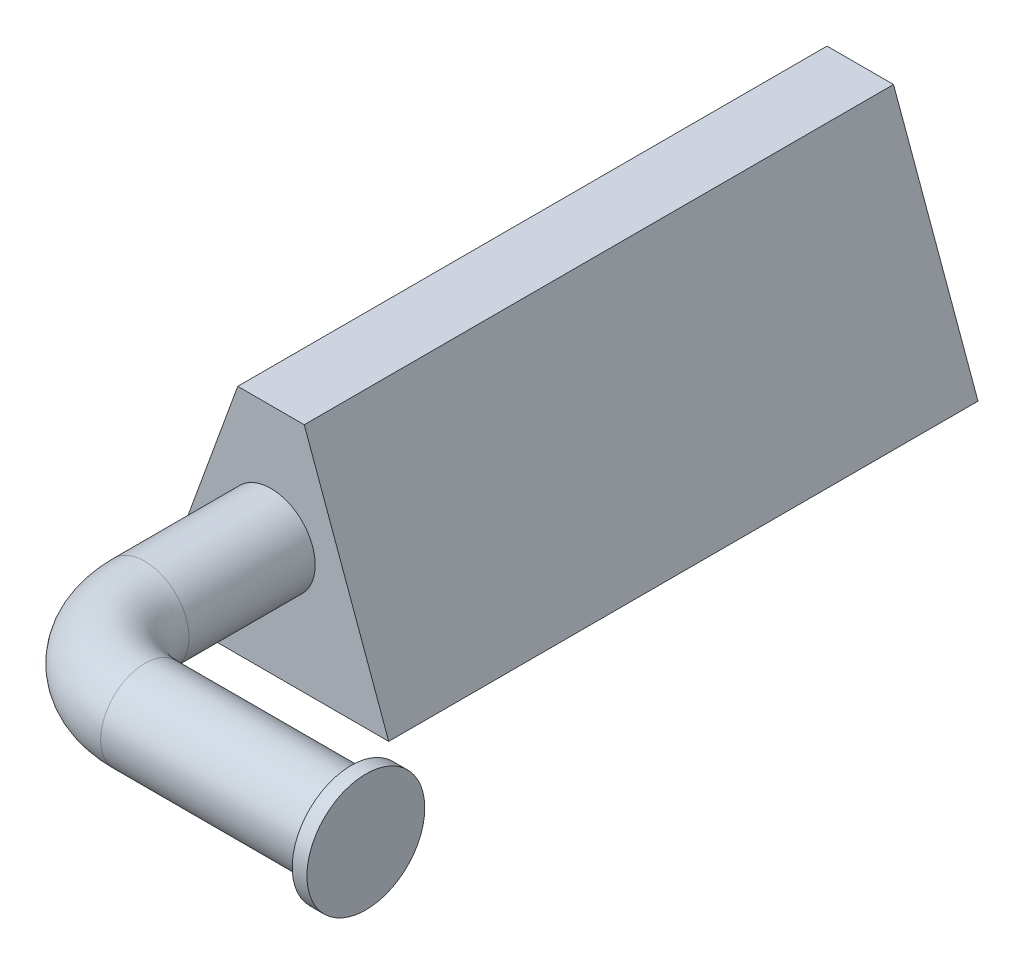
ISO-10303-21;
HEADER;
FILE_DESCRIPTION(('STEP AP214'),'2;1');
FILE_NAME('part.step','',(''),(''),'','','');
FILE_SCHEMA(('AUTOMOTIVE_DESIGN { 1 0 10303 214 1 1 1 1 }'));
ENDSEC;
DATA;
#1=APPLICATION_CONTEXT('core data for automotive mechanical design processes');
#2=APPLICATION_PROTOCOL_DEFINITION('international standard','automotive_design',2000,#1);
#3=PRODUCT_CONTEXT('',#1,'mechanical');
#4=PRODUCT('Part','Part','',(#3));
#5=PRODUCT_RELATED_PRODUCT_CATEGORY('part','',(#4));
#6=PRODUCT_DEFINITION_FORMATION('','',#4);
#7=PRODUCT_DEFINITION_CONTEXT('part definition',#1,'design');
#8=PRODUCT_DEFINITION('design','',#6,#7);
#9=PRODUCT_DEFINITION_SHAPE('','',#8);
#10=(LENGTH_UNIT() NAMED_UNIT(*) SI_UNIT(.MILLI.,.METRE.));
#11=(NAMED_UNIT(*) PLANE_ANGLE_UNIT() SI_UNIT($,.RADIAN.));
#12=(NAMED_UNIT(*) SI_UNIT($,.STERADIAN.) SOLID_ANGLE_UNIT());
#13=UNCERTAINTY_MEASURE_WITH_UNIT(LENGTH_MEASURE(1.E-05),#10,'distance_accuracy_value','');
#14=(GEOMETRIC_REPRESENTATION_CONTEXT(3) GLOBAL_UNCERTAINTY_ASSIGNED_CONTEXT((#13)) GLOBAL_UNIT_ASSIGNED_CONTEXT((#10,
#11,#12)) REPRESENTATION_CONTEXT('',''));
#15=CARTESIAN_POINT('',(0.,0.,0.));
#16=DIRECTION('',(0.,0.,1.));
#17=DIRECTION('',(1.,0.,0.));
#18=AXIS2_PLACEMENT_3D('',#15,#16,#17);
#19=CARTESIAN_POINT('',(15.9790533746583,0.,40.));
#20=DIRECTION('',(0.,1.,0.));
#21=DIRECTION('',(0.,0.,1.));
#22=AXIS2_PLACEMENT_3D('',#19,#20,#21);
#23=PLANE('',#22);
#24=DIRECTION('',(1.,0.,0.));
#25=VECTOR('',#24,1.);
#26=CARTESIAN_POINT('',(15.9790533746583,0.,0.));
#27=LINE('',#26,#25);
#28=CARTESIAN_POINT('',(0.,0.,0.));
#29=VERTEX_POINT('',#28);
#30=CARTESIAN_POINT('',(15.9790533746583,0.,0.));
#31=VERTEX_POINT('',#30);
#32=EDGE_CURVE('E109',#29,#31,#27,.T.);
#33=ORIENTED_EDGE('',*,*,#32,.T.);
#34=DIRECTION('',(0.,0.,-1.));
#35=VECTOR('',#34,1.);
#36=CARTESIAN_POINT('',(15.9790533746583,0.,40.));
#37=LINE('',#36,#35);
#38=CARTESIAN_POINT('',(15.9790533746583,0.,40.));
#39=VERTEX_POINT('',#38);
#40=EDGE_CURVE('E46',#39,#31,#37,.T.);
#41=ORIENTED_EDGE('',*,*,#40,.F.);
#42=DIRECTION('',(1.,0.,0.));
#43=VECTOR('',#42,1.);
#44=CARTESIAN_POINT('',(15.9790533746583,0.,40.));
#45=LINE('',#44,#43);
#46=CARTESIAN_POINT('',(0.,0.,40.));
#47=VERTEX_POINT('',#46);
#48=EDGE_CURVE('E96',#47,#39,#45,.T.);
#49=ORIENTED_EDGE('',*,*,#48,.F.);
#50=DIRECTION('',(0.,0.,-1.));
#51=VECTOR('',#50,1.);
#52=CARTESIAN_POINT('',(0.,0.,40.));
#53=LINE('',#52,#51);
#54=EDGE_CURVE('E105',#47,#29,#53,.T.);
#55=ORIENTED_EDGE('',*,*,#54,.T.);
#56=EDGE_LOOP('',(#33,#41,#49,#55));
#57=FACE_BOUND('',#56,.T.);
#58=ADVANCED_FACE('F43',(#57),#23,.F.);
#59=CARTESIAN_POINT('',(15.9790533746583,0.,40.));
#60=DIRECTION('',(-0.939692620785909,-0.342020143325666,0.));
#61=DIRECTION('',(0.342020143325666,-0.939692620785909,0.));
#62=AXIS2_PLACEMENT_3D('',#59,#60,#61);
#63=PLANE('',#62);
#64=DIRECTION('',(-0.342020143325666,0.939692620785909,0.));
#65=VECTOR('',#64,1.);
#66=CARTESIAN_POINT('',(15.9790533746583,0.,0.));
#67=LINE('',#66,#65);
#68=CARTESIAN_POINT('',(10.2465221849657,15.75,0.));
#69=VERTEX_POINT('',#68);
#70=EDGE_CURVE('E101',#31,#69,#67,.T.);
#71=ORIENTED_EDGE('',*,*,#70,.T.);
#72=DIRECTION('',(0.,0.,-1.));
#73=VECTOR('',#72,1.);
#74=CARTESIAN_POINT('',(10.2465221849657,15.75,40.));
#75=LINE('',#74,#73);
#76=CARTESIAN_POINT('',(10.2465221849657,15.75,40.));
#77=VERTEX_POINT('',#76);
#78=EDGE_CURVE('E99',#77,#69,#75,.T.);
#79=ORIENTED_EDGE('',*,*,#78,.F.);
#80=DIRECTION('',(-0.342020143325666,0.939692620785909,0.));
#81=VECTOR('',#80,1.);
#82=CARTESIAN_POINT('',(15.9790533746583,0.,40.));
#83=LINE('',#82,#81);
#84=EDGE_CURVE('E91',#39,#77,#83,.T.);
#85=ORIENTED_EDGE('',*,*,#84,.F.);
#86=ORIENTED_EDGE('',*,*,#40,.T.);
#87=EDGE_LOOP('',(#71,#79,#85,#86));
#88=FACE_BOUND('',#87,.T.);
#89=ADVANCED_FACE('F100',(#88),#63,.F.);
#90=CARTESIAN_POINT('',(10.2465221849657,15.75,40.));
#91=DIRECTION('',(0.,-1.,0.));
#92=DIRECTION('',(0.,0.,-1.));
#93=AXIS2_PLACEMENT_3D('',#90,#91,#92);
#94=PLANE('',#93);
#95=DIRECTION('',(-1.,0.,0.));
#96=VECTOR('',#95,1.);
#97=CARTESIAN_POINT('',(10.2465221849657,15.75,0.));
#98=LINE('',#97,#96);
#99=CARTESIAN_POINT('',(5.73253118969252,15.75,0.));
#100=VERTEX_POINT('',#99);
#101=EDGE_CURVE('E77',#69,#100,#98,.T.);
#102=ORIENTED_EDGE('',*,*,#101,.T.);
#103=DIRECTION('',(0.,0.,-1.));
#104=VECTOR('',#103,1.);
#105=CARTESIAN_POINT('',(5.73253118969252,15.75,40.));
#106=LINE('',#105,#104);
#107=CARTESIAN_POINT('',(5.73253118969252,15.75,40.));
#108=VERTEX_POINT('',#107);
#109=EDGE_CURVE('E102',#108,#100,#106,.T.);
#110=ORIENTED_EDGE('',*,*,#109,.F.);
#111=DIRECTION('',(-1.,0.,0.));
#112=VECTOR('',#111,1.);
#113=CARTESIAN_POINT('',(10.2465221849657,15.75,40.));
#114=LINE('',#113,#112);
#115=EDGE_CURVE('E94',#77,#108,#114,.T.);
#116=ORIENTED_EDGE('',*,*,#115,.F.);
#117=ORIENTED_EDGE('',*,*,#78,.T.);
#118=EDGE_LOOP('',(#102,#110,#116,#117));
#119=FACE_BOUND('',#118,.T.);
#120=ADVANCED_FACE('F103',(#119),#94,.F.);
#121=CARTESIAN_POINT('',(5.73253118969252,15.75,40.));
#122=DIRECTION('',(0.939692620785911,-0.34202014332566,0.));
#123=DIRECTION('',(0.34202014332566,0.939692620785912,0.));
#124=AXIS2_PLACEMENT_3D('',#121,#122,#123);
#125=PLANE('',#124);
#126=DIRECTION('',(-0.34202014332566,-0.939692620785911,0.));
#127=VECTOR('',#126,1.);
#128=CARTESIAN_POINT('',(5.73253118969252,15.75,0.));
#129=LINE('',#128,#127);
#130=EDGE_CURVE('E83',#100,#29,#129,.T.);
#131=ORIENTED_EDGE('',*,*,#130,.T.);
#132=ORIENTED_EDGE('',*,*,#54,.F.);
#133=DIRECTION('',(-0.34202014332566,-0.939692620785911,0.));
#134=VECTOR('',#133,1.);
#135=CARTESIAN_POINT('',(5.73253118969252,15.75,40.));
#136=LINE('',#135,#134);
#137=EDGE_CURVE('E60',#108,#47,#136,.T.);
#138=ORIENTED_EDGE('',*,*,#137,.F.);
#139=ORIENTED_EDGE('',*,*,#109,.T.);
#140=EDGE_LOOP('',(#131,#132,#138,#139));
#141=FACE_BOUND('',#140,.T.);
#142=ADVANCED_FACE('F117',(#141),#125,.F.);
#143=CARTESIAN_POINT('',(0.,0.,40.));
#144=DIRECTION('',(0.,0.,1.));
#145=DIRECTION('',(1.,0.,0.));
#146=AXIS2_PLACEMENT_3D('',#143,#144,#145);
#147=PLANE('',#146);
#148=CARTESIAN_POINT('',(7.98952668732916,7.87499999999999,40.));
#149=DIRECTION('',(0.,0.,1.));
#150=DIRECTION('',(1.,0.,0.));
#151=AXIS2_PLACEMENT_3D('',#148,#149,#150);
#152=CIRCLE('',#151,3.);
#153=CARTESIAN_POINT('',(10.9895266873292,7.87499999999999,40.));
#154=VERTEX_POINT('',#153);
#155=EDGE_CURVE('E11',#154,#154,#152,.T.);
#156=ORIENTED_EDGE('',*,*,#155,.F.);
#157=EDGE_LOOP('',(#156));
#158=FACE_BOUND('',#157,.T.);
#159=ORIENTED_EDGE('',*,*,#48,.T.);
#160=ORIENTED_EDGE('',*,*,#84,.T.);
#161=ORIENTED_EDGE('',*,*,#115,.T.);
#162=ORIENTED_EDGE('',*,*,#137,.T.);
#163=EDGE_LOOP('',(#159,#160,#161,#162));
#164=FACE_BOUND('',#163,.T.);
#165=ADVANCED_FACE('F92',(#158,#164),#147,.T.);
#166=CARTESIAN_POINT('',(0.,0.,0.));
#167=DIRECTION('',(0.,0.,1.));
#168=DIRECTION('',(1.,0.,0.));
#169=AXIS2_PLACEMENT_3D('',#166,#167,#168);
#170=PLANE('',#169);
#171=ORIENTED_EDGE('',*,*,#32,.F.);
#172=ORIENTED_EDGE('',*,*,#130,.F.);
#173=ORIENTED_EDGE('',*,*,#101,.F.);
#174=ORIENTED_EDGE('',*,*,#70,.F.);
#175=EDGE_LOOP('',(#171,#172,#173,#174));
#176=FACE_BOUND('',#175,.T.);
#177=ADVANCED_FACE('F120',(#176),#170,.F.);
#178=CARTESIAN_POINT('',(7.98952668732916,7.87499999999999,40.));
#179=DIRECTION('',(0.,0.,1.));
#180=DIRECTION('',(1.,0.,0.));
#181=AXIS2_PLACEMENT_3D('',#178,#179,#180);
#182=CYLINDRICAL_SURFACE('',#181,3.);
#183=CARTESIAN_POINT('',(7.98952668732916,7.87499999999999,48.56216486));
#184=DIRECTION('',(0.,0.,1.));
#185=DIRECTION('',(1.,0.,0.));
#186=AXIS2_PLACEMENT_3D('',#183,#184,#185);
#187=CIRCLE('',#186,3.);
#188=CARTESIAN_POINT('',(4.98952668732916,7.87499999999999,48.56216486));
#189=VERTEX_POINT('',#188);
#190=EDGE_CURVE('E128',#189,#189,#187,.T.);
#191=ORIENTED_EDGE('',*,*,#190,.F.);
#192=EDGE_LOOP('',(#191));
#193=FACE_BOUND('',#192,.T.);
#194=ORIENTED_EDGE('',*,*,#155,.T.);
#195=EDGE_LOOP('',(#194));
#196=FACE_BOUND('',#195,.T.);
#197=ADVANCED_FACE('F145',(#193,#196),#182,.T.);
#198=CARTESIAN_POINT('',(13.9895266873292,7.87499999999999,48.56216486));
#199=DIRECTION('',(0.,1.,0.));
#200=DIRECTION('',(0.,0.,1.));
#201=AXIS2_PLACEMENT_3D('',#198,#199,#200);
#202=TOROIDAL_SURFACE('',#201,6.,3.);
#203=CARTESIAN_POINT('',(13.9895266873292,7.87499999999999,54.56216486));
#204=DIRECTION('',(1.,0.,0.));
#205=DIRECTION('',(0.,0.,-1.));
#206=AXIS2_PLACEMENT_3D('',#203,#204,#205);
#207=CIRCLE('',#206,3.);
#208=CARTESIAN_POINT('',(13.9895266873292,7.87499999999999,57.56216486));
#209=VERTEX_POINT('',#208);
#210=EDGE_CURVE('E125',#209,#209,#207,.T.);
#211=CARTESIAN_POINT('',(13.9895266873292,7.87499999999999,48.56216486));
#212=DIRECTION('',(0.,1.,0.));
#213=DIRECTION('',(0.,0.,1.));
#214=AXIS2_PLACEMENT_3D('',#211,#212,#213);
#215=CIRCLE('',#214,9.);
#216=EDGE_CURVE('',#189,#209,#215,.T.);
#217=ORIENTED_EDGE('',*,*,#190,.T.);
#218=ORIENTED_EDGE('',*,*,#210,.F.);
#219=ORIENTED_EDGE('',*,*,#216,.T.);
#220=ORIENTED_EDGE('',*,*,#216,.F.);
#221=EDGE_LOOP('',(#217,#219,#218,#220));
#222=FACE_BOUND('',#221,.T.);
#223=ADVANCED_FACE('F174',(#222),#202,.T.);
#224=CARTESIAN_POINT('',(13.9895266873292,7.87499999999999,54.56216486));
#225=DIRECTION('',(1.,0.,0.));
#226=DIRECTION('',(0.,0.,-1.));
#227=AXIS2_PLACEMENT_3D('',#224,#225,#226);
#228=CYLINDRICAL_SURFACE('',#227,3.);
#229=CARTESIAN_POINT('',(27.9895266873292,7.87499999999999,54.56216486));
#230=DIRECTION('',(1.,0.,0.));
#231=DIRECTION('',(0.,0.,-1.));
#232=AXIS2_PLACEMENT_3D('',#229,#230,#231);
#233=CIRCLE('',#232,3.);
#234=CARTESIAN_POINT('',(27.9895266873292,7.87499999999999,51.56216486));
#235=VERTEX_POINT('',#234);
#236=EDGE_CURVE('E112',#235,#235,#233,.T.);
#237=ORIENTED_EDGE('',*,*,#236,.F.);
#238=EDGE_LOOP('',(#237));
#239=FACE_BOUND('',#238,.T.);
#240=ORIENTED_EDGE('',*,*,#210,.T.);
#241=EDGE_LOOP('',(#240));
#242=FACE_BOUND('',#241,.T.);
#243=ADVANCED_FACE('F143',(#239,#242),#228,.T.);
#244=CARTESIAN_POINT('',(28.9895266873292,7.87499999999999,54.56216486));
#245=DIRECTION('',(-1.,0.,0.));
#246=DIRECTION('',(0.,0.,1.));
#247=AXIS2_PLACEMENT_3D('',#244,#245,#246);
#248=CYLINDRICAL_SURFACE('',#247,4.00000000000001);
#249=CARTESIAN_POINT('',(28.9895266873292,7.87499999999999,54.56216486));
#250=DIRECTION('',(1.,0.,0.));
#251=DIRECTION('',(0.,0.,-1.));
#252=AXIS2_PLACEMENT_3D('',#249,#250,#251);
#253=CIRCLE('',#252,4.00000000000001);
#254=CARTESIAN_POINT('',(28.9895266873292,7.87499999999999,50.56216486));
#255=VERTEX_POINT('',#254);
#256=EDGE_CURVE('E130',#255,#255,#253,.T.);
#257=ORIENTED_EDGE('',*,*,#256,.F.);
#258=EDGE_LOOP('',(#257));
#259=FACE_BOUND('',#258,.T.);
#260=CARTESIAN_POINT('',(27.9895266873292,7.87499999999999,54.56216486));
#261=DIRECTION('',(1.,0.,0.));
#262=DIRECTION('',(0.,0.,-1.));
#263=AXIS2_PLACEMENT_3D('',#260,#261,#262);
#264=CIRCLE('',#263,4.00000000000001);
#265=CARTESIAN_POINT('',(27.9895266873292,7.87499999999999,50.56216486));
#266=VERTEX_POINT('',#265);
#267=EDGE_CURVE('E132',#266,#266,#264,.T.);
#268=ORIENTED_EDGE('',*,*,#267,.T.);
#269=EDGE_LOOP('',(#268));
#270=FACE_BOUND('',#269,.T.);
#271=ADVANCED_FACE('F140',(#259,#270),#248,.T.);
#272=CARTESIAN_POINT('',(28.9895266873292,7.87499999999999,54.56216486));
#273=DIRECTION('',(1.,0.,0.));
#274=DIRECTION('',(0.,0.,-1.));
#275=AXIS2_PLACEMENT_3D('',#272,#273,#274);
#276=PLANE('',#275);
#277=ORIENTED_EDGE('',*,*,#256,.T.);
#278=EDGE_LOOP('',(#277));
#279=FACE_BOUND('',#278,.T.);
#280=ADVANCED_FACE('F138',(#279),#276,.T.);
#281=CARTESIAN_POINT('',(27.9895266873292,7.87499999999999,54.56216486));
#282=DIRECTION('',(1.,0.,0.));
#283=DIRECTION('',(0.,0.,-1.));
#284=AXIS2_PLACEMENT_3D('',#281,#282,#283);
#285=PLANE('',#284);
#286=ORIENTED_EDGE('',*,*,#236,.T.);
#287=EDGE_LOOP('',(#286));
#288=FACE_BOUND('',#287,.T.);
#289=ORIENTED_EDGE('',*,*,#267,.F.);
#290=EDGE_LOOP('',(#289));
#291=FACE_BOUND('',#290,.T.);
#292=ADVANCED_FACE('F148',(#288,#291),#285,.F.);
#293=CLOSED_SHELL('',(#58,#89,#120,#142,#165,#177,#197,#223,#243,#271,#280,#292));
#294=MANIFOLD_SOLID_BREP('B2',#293);
#295=ADVANCED_BREP_SHAPE_REPRESENTATION('',(#18,#294),#14);
#296=SHAPE_DEFINITION_REPRESENTATION(#9,#295);
ENDSEC;
END-ISO-10303-21;
